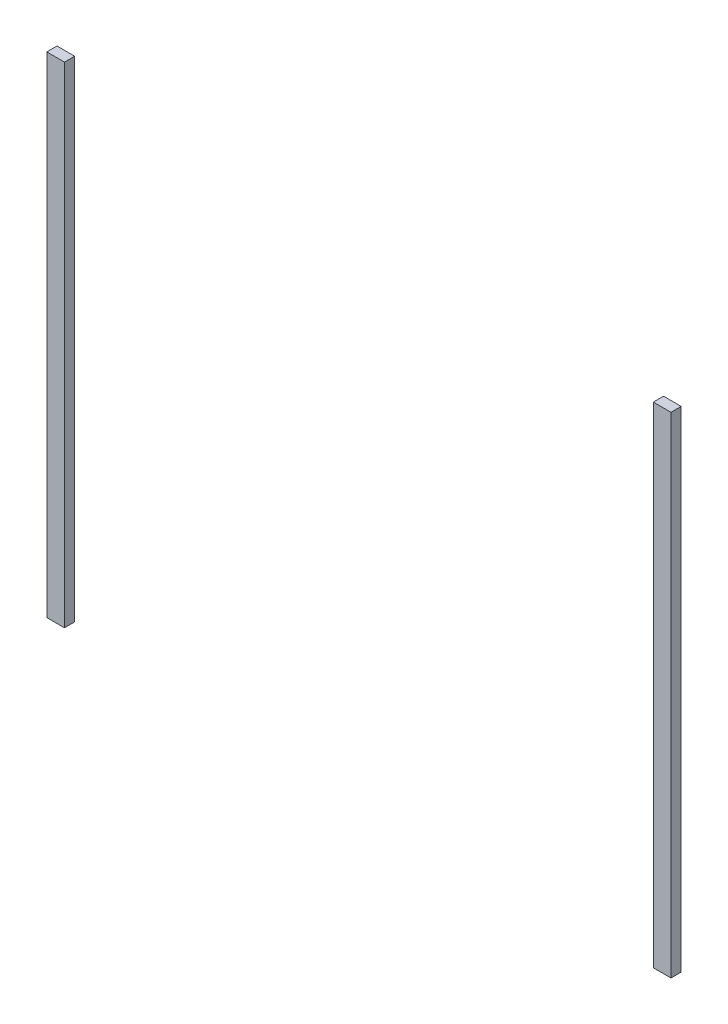
ISO-10303-21;
HEADER;
FILE_DESCRIPTION(('STEP AP214'),'2;1');
FILE_NAME('part.step','',(''),(''),'','','');
FILE_SCHEMA(('AUTOMOTIVE_DESIGN { 1 0 10303 214 1 1 1 1 }'));
ENDSEC;
DATA;
#1=APPLICATION_CONTEXT('core data for automotive mechanical design processes');
#2=APPLICATION_PROTOCOL_DEFINITION('international standard','automotive_design',2000,#1);
#3=PRODUCT_CONTEXT('',#1,'mechanical');
#4=PRODUCT('Part','Part','',(#3));
#5=PRODUCT_RELATED_PRODUCT_CATEGORY('part','',(#4));
#6=PRODUCT_DEFINITION_FORMATION('','',#4);
#7=PRODUCT_DEFINITION_CONTEXT('part definition',#1,'design');
#8=PRODUCT_DEFINITION('design','',#6,#7);
#9=PRODUCT_DEFINITION_SHAPE('','',#8);
#10=(LENGTH_UNIT() NAMED_UNIT(*) SI_UNIT(.MILLI.,.METRE.));
#11=(NAMED_UNIT(*) PLANE_ANGLE_UNIT() SI_UNIT($,.RADIAN.));
#12=(NAMED_UNIT(*) SI_UNIT($,.STERADIAN.) SOLID_ANGLE_UNIT());
#13=UNCERTAINTY_MEASURE_WITH_UNIT(LENGTH_MEASURE(1.E-05),#10,'distance_accuracy_value','');
#14=(GEOMETRIC_REPRESENTATION_CONTEXT(3) GLOBAL_UNCERTAINTY_ASSIGNED_CONTEXT((#13)) GLOBAL_UNIT_ASSIGNED_CONTEXT((#10,
#11,#12)) REPRESENTATION_CONTEXT('',''));
#15=CARTESIAN_POINT('',(0.,0.,0.));
#16=DIRECTION('',(0.,0.,1.));
#17=DIRECTION('',(1.,0.,0.));
#18=AXIS2_PLACEMENT_3D('',#15,#16,#17);
#19=CARTESIAN_POINT('',(-388.332348418702,0.,659.911357683738));
#20=DIRECTION('',(0.,0.,1.));
#21=DIRECTION('',(1.,0.,0.));
#22=AXIS2_PLACEMENT_3D('',#19,#20,#21);
#23=PLANE('',#22);
#24=DIRECTION('',(1.,0.,0.));
#25=VECTOR('',#24,1.);
#26=CARTESIAN_POINT('',(-388.332348418702,609.6,659.911357683738));
#27=LINE('',#26,#25);
#28=CARTESIAN_POINT('',(-388.332348418702,609.6,659.911357683738));
#29=VERTEX_POINT('',#28);
#30=CARTESIAN_POINT('',(-366.335303162584,609.6,659.911357683738));
#31=VERTEX_POINT('',#30);
#32=EDGE_CURVE('E107',#29,#31,#27,.T.);
#33=ORIENTED_EDGE('',*,*,#32,.F.);
#34=DIRECTION('',(0.,1.,0.));
#35=VECTOR('',#34,1.);
#36=CARTESIAN_POINT('',(-388.332348418702,0.,659.911357683738));
#37=LINE('',#36,#35);
#38=CARTESIAN_POINT('',(-388.332348418702,0.,659.911357683738));
#39=VERTEX_POINT('',#38);
#40=EDGE_CURVE('E12',#39,#29,#37,.T.);
#41=ORIENTED_EDGE('',*,*,#40,.F.);
#42=DIRECTION('',(1.,0.,0.));
#43=VECTOR('',#42,1.);
#44=CARTESIAN_POINT('',(-388.332348418702,0.,659.911357683738));
#45=LINE('',#44,#43);
#46=CARTESIAN_POINT('',(-366.335303162584,0.,659.911357683738));
#47=VERTEX_POINT('',#46);
#48=EDGE_CURVE('E101',#39,#47,#45,.T.);
#49=ORIENTED_EDGE('',*,*,#48,.T.);
#50=DIRECTION('',(0.,1.,0.));
#51=VECTOR('',#50,1.);
#52=CARTESIAN_POINT('',(-366.335303162584,0.,659.911357683738));
#53=LINE('',#52,#51);
#54=EDGE_CURVE('E46',#47,#31,#53,.T.);
#55=ORIENTED_EDGE('',*,*,#54,.T.);
#56=EDGE_LOOP('',(#33,#41,#49,#55));
#57=FACE_BOUND('',#56,.T.);
#58=ADVANCED_FACE('F43',(#57),#23,.T.);
#59=CARTESIAN_POINT('',(-388.332348418702,0.,647.211357683746));
#60=DIRECTION('',(-1.,0.,0.));
#61=DIRECTION('',(0.,0.,1.));
#62=AXIS2_PLACEMENT_3D('',#59,#60,#61);
#63=PLANE('',#62);
#64=DIRECTION('',(0.,0.,1.));
#65=VECTOR('',#64,1.);
#66=CARTESIAN_POINT('',(-388.332348418702,609.6,647.211357683746));
#67=LINE('',#66,#65);
#68=CARTESIAN_POINT('',(-388.332348418702,609.6,647.211357683746));
#69=VERTEX_POINT('',#68);
#70=EDGE_CURVE('E103',#69,#29,#67,.T.);
#71=ORIENTED_EDGE('',*,*,#70,.F.);
#72=DIRECTION('',(0.,1.,0.));
#73=VECTOR('',#72,1.);
#74=CARTESIAN_POINT('',(-388.332348418702,0.,647.211357683746));
#75=LINE('',#74,#73);
#76=CARTESIAN_POINT('',(-388.332348418702,0.,647.211357683746));
#77=VERTEX_POINT('',#76);
#78=EDGE_CURVE('E52',#77,#69,#75,.T.);
#79=ORIENTED_EDGE('',*,*,#78,.F.);
#80=DIRECTION('',(0.,0.,1.));
#81=VECTOR('',#80,1.);
#82=CARTESIAN_POINT('',(-388.332348418702,0.,647.211357683746));
#83=LINE('',#82,#81);
#84=EDGE_CURVE('E98',#77,#39,#83,.T.);
#85=ORIENTED_EDGE('',*,*,#84,.T.);
#86=ORIENTED_EDGE('',*,*,#40,.T.);
#87=EDGE_LOOP('',(#71,#79,#85,#86));
#88=FACE_BOUND('',#87,.T.);
#89=ADVANCED_FACE('F117',(#88),#63,.T.);
#90=CARTESIAN_POINT('',(-366.335303162584,0.,647.211357683746));
#91=DIRECTION('',(0.,0.,-1.));
#92=DIRECTION('',(-1.,0.,0.));
#93=AXIS2_PLACEMENT_3D('',#90,#91,#92);
#94=PLANE('',#93);
#95=DIRECTION('',(-1.,0.,0.));
#96=VECTOR('',#95,1.);
#97=CARTESIAN_POINT('',(-366.335303162584,609.6,647.211357683746));
#98=LINE('',#97,#96);
#99=CARTESIAN_POINT('',(-366.335303162584,609.6,647.211357683746));
#100=VERTEX_POINT('',#99);
#101=EDGE_CURVE('E93',#100,#69,#98,.T.);
#102=ORIENTED_EDGE('',*,*,#101,.F.);
#103=DIRECTION('',(0.,1.,0.));
#104=VECTOR('',#103,1.);
#105=CARTESIAN_POINT('',(-366.335303162584,0.,647.211357683746));
#106=LINE('',#105,#104);
#107=CARTESIAN_POINT('',(-366.335303162584,0.,647.211357683746));
#108=VERTEX_POINT('',#107);
#109=EDGE_CURVE('E88',#108,#100,#106,.T.);
#110=ORIENTED_EDGE('',*,*,#109,.F.);
#111=DIRECTION('',(-1.,0.,0.));
#112=VECTOR('',#111,1.);
#113=CARTESIAN_POINT('',(-366.335303162584,0.,647.211357683746));
#114=LINE('',#113,#112);
#115=EDGE_CURVE('E91',#108,#77,#114,.T.);
#116=ORIENTED_EDGE('',*,*,#115,.T.);
#117=ORIENTED_EDGE('',*,*,#78,.T.);
#118=EDGE_LOOP('',(#102,#110,#116,#117));
#119=FACE_BOUND('',#118,.T.);
#120=ADVANCED_FACE('F90',(#119),#94,.T.);
#121=CARTESIAN_POINT('',(-366.335303162584,0.,659.911357683738));
#122=DIRECTION('',(1.,0.,0.));
#123=DIRECTION('',(0.,0.,-1.));
#124=AXIS2_PLACEMENT_3D('',#121,#122,#123);
#125=PLANE('',#124);
#126=DIRECTION('',(0.,0.,-1.));
#127=VECTOR('',#126,1.);
#128=CARTESIAN_POINT('',(-366.335303162584,609.6,659.911357683738));
#129=LINE('',#128,#127);
#130=EDGE_CURVE('E110',#31,#100,#129,.T.);
#131=ORIENTED_EDGE('',*,*,#130,.F.);
#132=ORIENTED_EDGE('',*,*,#54,.F.);
#133=DIRECTION('',(0.,0.,-1.));
#134=VECTOR('',#133,1.);
#135=CARTESIAN_POINT('',(-366.335303162584,0.,659.911357683738));
#136=LINE('',#135,#134);
#137=EDGE_CURVE('E97',#47,#108,#136,.T.);
#138=ORIENTED_EDGE('',*,*,#137,.T.);
#139=ORIENTED_EDGE('',*,*,#109,.T.);
#140=EDGE_LOOP('',(#131,#132,#138,#139));
#141=FACE_BOUND('',#140,.T.);
#142=ADVANCED_FACE('F100',(#141),#125,.T.);
#143=CARTESIAN_POINT('',(0.,0.,0.));
#144=DIRECTION('',(0.,1.,0.));
#145=DIRECTION('',(0.,0.,1.));
#146=AXIS2_PLACEMENT_3D('',#143,#144,#145);
#147=PLANE('',#146);
#148=ORIENTED_EDGE('',*,*,#48,.F.);
#149=ORIENTED_EDGE('',*,*,#84,.F.);
#150=ORIENTED_EDGE('',*,*,#115,.F.);
#151=ORIENTED_EDGE('',*,*,#137,.F.);
#152=EDGE_LOOP('',(#148,#149,#150,#151));
#153=FACE_BOUND('',#152,.T.);
#154=ADVANCED_FACE('F96',(#153),#147,.F.);
#155=CARTESIAN_POINT('',(0.,609.6,0.));
#156=DIRECTION('',(0.,1.,0.));
#157=DIRECTION('',(0.,0.,1.));
#158=AXIS2_PLACEMENT_3D('',#155,#156,#157);
#159=PLANE('',#158);
#160=ORIENTED_EDGE('',*,*,#32,.T.);
#161=ORIENTED_EDGE('',*,*,#130,.T.);
#162=ORIENTED_EDGE('',*,*,#101,.T.);
#163=ORIENTED_EDGE('',*,*,#70,.T.);
#164=EDGE_LOOP('',(#160,#161,#162,#163));
#165=FACE_BOUND('',#164,.T.);
#166=ADVANCED_FACE('F116',(#165),#159,.T.);
#167=CLOSED_SHELL('',(#58,#89,#120,#142,#154,#166));
#168=MANIFOLD_SOLID_BREP('B2',#167);
#169=CARTESIAN_POINT('',(366.335303162592,0.,659.911357683738));
#170=DIRECTION('',(0.,0.,1.));
#171=DIRECTION('',(1.,0.,0.));
#172=AXIS2_PLACEMENT_3D('',#169,#170,#171);
#173=PLANE('',#172);
#174=DIRECTION('',(1.,0.,0.));
#175=VECTOR('',#174,1.);
#176=CARTESIAN_POINT('',(366.335303162592,609.6,659.911357683738));
#177=LINE('',#176,#175);
#178=CARTESIAN_POINT('',(366.335303162592,609.6,659.911357683738));
#179=VERTEX_POINT('',#178);
#180=CARTESIAN_POINT('',(388.332348418711,609.6,659.911357683738));
#181=VERTEX_POINT('',#180);
#182=EDGE_CURVE('E231',#179,#181,#177,.T.);
#183=ORIENTED_EDGE('',*,*,#182,.F.);
#184=DIRECTION('',(0.,1.,0.));
#185=VECTOR('',#184,1.);
#186=CARTESIAN_POINT('',(366.335303162592,0.,659.911357683738));
#187=LINE('',#186,#185);
#188=CARTESIAN_POINT('',(366.335303162592,0.,659.911357683738));
#189=VERTEX_POINT('',#188);
#190=EDGE_CURVE('E41',#189,#179,#187,.T.);
#191=ORIENTED_EDGE('',*,*,#190,.F.);
#192=DIRECTION('',(1.,0.,0.));
#193=VECTOR('',#192,1.);
#194=CARTESIAN_POINT('',(366.335303162592,0.,659.911357683738));
#195=LINE('',#194,#193);
#196=CARTESIAN_POINT('',(388.332348418711,0.,659.911357683738));
#197=VERTEX_POINT('',#196);
#198=EDGE_CURVE('E225',#189,#197,#195,.T.);
#199=ORIENTED_EDGE('',*,*,#198,.T.);
#200=DIRECTION('',(0.,1.,0.));
#201=VECTOR('',#200,1.);
#202=CARTESIAN_POINT('',(388.332348418711,0.,659.911357683738));
#203=LINE('',#202,#201);
#204=EDGE_CURVE('E170',#197,#181,#203,.T.);
#205=ORIENTED_EDGE('',*,*,#204,.T.);
#206=EDGE_LOOP('',(#183,#191,#199,#205));
#207=FACE_BOUND('',#206,.T.);
#208=ADVANCED_FACE('F167',(#207),#173,.T.);
#209=CARTESIAN_POINT('',(366.335303162592,0.,647.211357683746));
#210=DIRECTION('',(-1.,0.,0.));
#211=DIRECTION('',(0.,0.,1.));
#212=AXIS2_PLACEMENT_3D('',#209,#210,#211);
#213=PLANE('',#212);
#214=DIRECTION('',(0.,0.,1.));
#215=VECTOR('',#214,1.);
#216=CARTESIAN_POINT('',(366.335303162592,609.6,647.211357683746));
#217=LINE('',#216,#215);
#218=CARTESIAN_POINT('',(366.335303162592,609.6,647.211357683746));
#219=VERTEX_POINT('',#218);
#220=EDGE_CURVE('E227',#219,#179,#217,.T.);
#221=ORIENTED_EDGE('',*,*,#220,.F.);
#222=DIRECTION('',(0.,1.,0.));
#223=VECTOR('',#222,1.);
#224=CARTESIAN_POINT('',(366.335303162592,0.,647.211357683746));
#225=LINE('',#224,#223);
#226=CARTESIAN_POINT('',(366.335303162592,0.,647.211357683746));
#227=VERTEX_POINT('',#226);
#228=EDGE_CURVE('E176',#227,#219,#225,.T.);
#229=ORIENTED_EDGE('',*,*,#228,.F.);
#230=DIRECTION('',(0.,0.,1.));
#231=VECTOR('',#230,1.);
#232=CARTESIAN_POINT('',(366.335303162592,0.,647.211357683746));
#233=LINE('',#232,#231);
#234=EDGE_CURVE('E222',#227,#189,#233,.T.);
#235=ORIENTED_EDGE('',*,*,#234,.T.);
#236=ORIENTED_EDGE('',*,*,#190,.T.);
#237=EDGE_LOOP('',(#221,#229,#235,#236));
#238=FACE_BOUND('',#237,.T.);
#239=ADVANCED_FACE('F241',(#238),#213,.T.);
#240=CARTESIAN_POINT('',(388.332348418711,0.,647.211357683746));
#241=DIRECTION('',(0.,0.,-1.));
#242=DIRECTION('',(-1.,0.,0.));
#243=AXIS2_PLACEMENT_3D('',#240,#241,#242);
#244=PLANE('',#243);
#245=DIRECTION('',(-1.,0.,0.));
#246=VECTOR('',#245,1.);
#247=CARTESIAN_POINT('',(388.332348418711,609.6,647.211357683746));
#248=LINE('',#247,#246);
#249=CARTESIAN_POINT('',(388.332348418711,609.6,647.211357683746));
#250=VERTEX_POINT('',#249);
#251=EDGE_CURVE('E217',#250,#219,#248,.T.);
#252=ORIENTED_EDGE('',*,*,#251,.F.);
#253=DIRECTION('',(0.,1.,0.));
#254=VECTOR('',#253,1.);
#255=CARTESIAN_POINT('',(388.332348418711,0.,647.211357683746));
#256=LINE('',#255,#254);
#257=CARTESIAN_POINT('',(388.332348418711,0.,647.211357683746));
#258=VERTEX_POINT('',#257);
#259=EDGE_CURVE('E212',#258,#250,#256,.T.);
#260=ORIENTED_EDGE('',*,*,#259,.F.);
#261=DIRECTION('',(-1.,0.,0.));
#262=VECTOR('',#261,1.);
#263=CARTESIAN_POINT('',(388.332348418711,0.,647.211357683746));
#264=LINE('',#263,#262);
#265=EDGE_CURVE('E215',#258,#227,#264,.T.);
#266=ORIENTED_EDGE('',*,*,#265,.T.);
#267=ORIENTED_EDGE('',*,*,#228,.T.);
#268=EDGE_LOOP('',(#252,#260,#266,#267));
#269=FACE_BOUND('',#268,.T.);
#270=ADVANCED_FACE('F214',(#269),#244,.T.);
#271=CARTESIAN_POINT('',(388.332348418711,0.,659.911357683738));
#272=DIRECTION('',(1.,0.,0.));
#273=DIRECTION('',(0.,0.,-1.));
#274=AXIS2_PLACEMENT_3D('',#271,#272,#273);
#275=PLANE('',#274);
#276=DIRECTION('',(0.,0.,-1.));
#277=VECTOR('',#276,1.);
#278=CARTESIAN_POINT('',(388.332348418711,609.6,659.911357683738));
#279=LINE('',#278,#277);
#280=EDGE_CURVE('E234',#181,#250,#279,.T.);
#281=ORIENTED_EDGE('',*,*,#280,.F.);
#282=ORIENTED_EDGE('',*,*,#204,.F.);
#283=DIRECTION('',(0.,0.,-1.));
#284=VECTOR('',#283,1.);
#285=CARTESIAN_POINT('',(388.332348418711,0.,659.911357683738));
#286=LINE('',#285,#284);
#287=EDGE_CURVE('E221',#197,#258,#286,.T.);
#288=ORIENTED_EDGE('',*,*,#287,.T.);
#289=ORIENTED_EDGE('',*,*,#259,.T.);
#290=EDGE_LOOP('',(#281,#282,#288,#289));
#291=FACE_BOUND('',#290,.T.);
#292=ADVANCED_FACE('F224',(#291),#275,.T.);
#293=CARTESIAN_POINT('',(0.,0.,0.));
#294=DIRECTION('',(0.,1.,0.));
#295=DIRECTION('',(0.,0.,1.));
#296=AXIS2_PLACEMENT_3D('',#293,#294,#295);
#297=PLANE('',#296);
#298=ORIENTED_EDGE('',*,*,#198,.F.);
#299=ORIENTED_EDGE('',*,*,#234,.F.);
#300=ORIENTED_EDGE('',*,*,#265,.F.);
#301=ORIENTED_EDGE('',*,*,#287,.F.);
#302=EDGE_LOOP('',(#298,#299,#300,#301));
#303=FACE_BOUND('',#302,.T.);
#304=ADVANCED_FACE('F220',(#303),#297,.F.);
#305=CARTESIAN_POINT('',(0.,609.6,0.));
#306=DIRECTION('',(0.,1.,0.));
#307=DIRECTION('',(0.,0.,1.));
#308=AXIS2_PLACEMENT_3D('',#305,#306,#307);
#309=PLANE('',#308);
#310=ORIENTED_EDGE('',*,*,#182,.T.);
#311=ORIENTED_EDGE('',*,*,#280,.T.);
#312=ORIENTED_EDGE('',*,*,#251,.T.);
#313=ORIENTED_EDGE('',*,*,#220,.T.);
#314=EDGE_LOOP('',(#310,#311,#312,#313));
#315=FACE_BOUND('',#314,.T.);
#316=ADVANCED_FACE('F240',(#315),#309,.T.);
#317=CLOSED_SHELL('',(#208,#239,#270,#292,#304,#316));
#318=MANIFOLD_SOLID_BREP('B6',#317);
#319=ADVANCED_BREP_SHAPE_REPRESENTATION('',(#18,#168,#318),#14);
#320=SHAPE_DEFINITION_REPRESENTATION(#9,#319);
ENDSEC;
END-ISO-10303-21;
